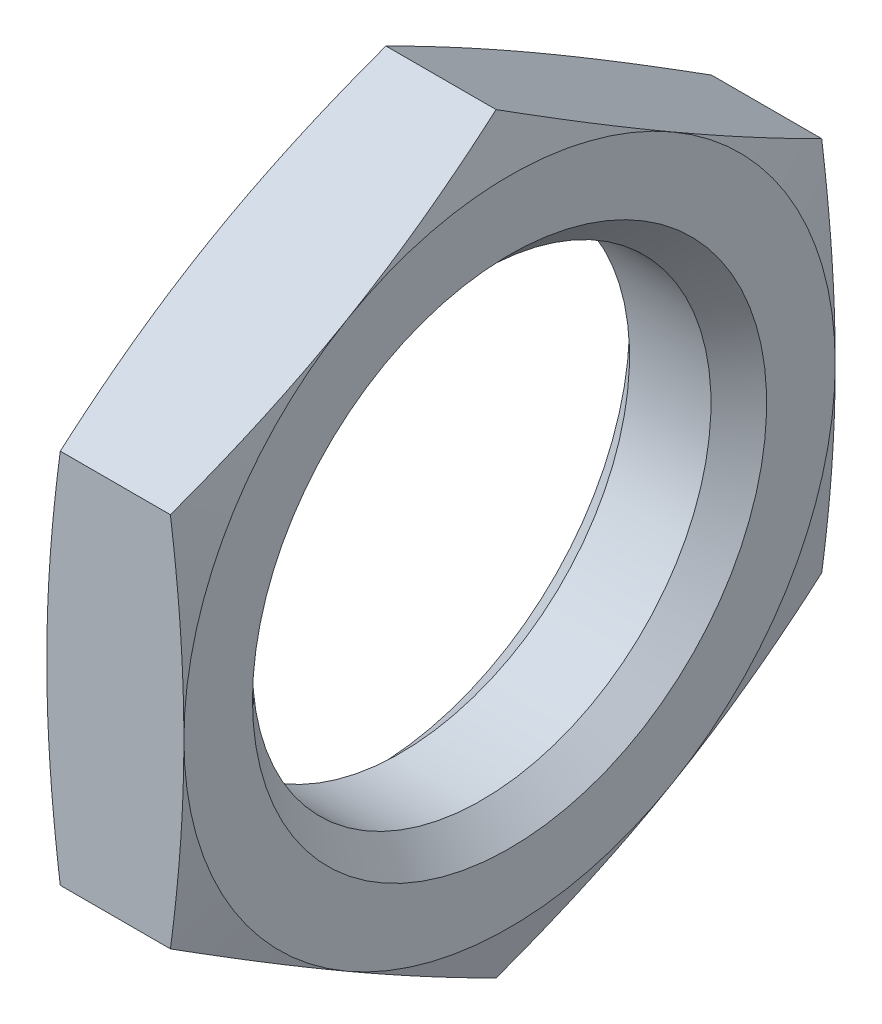
ISO-10303-21;
HEADER;
FILE_DESCRIPTION(('STEP AP214'),'2;1');
FILE_NAME('part.step','',(''),(''),'','','');
FILE_SCHEMA(('AUTOMOTIVE_DESIGN { 1 0 10303 214 1 1 1 1 }'));
ENDSEC;
DATA;
#1=APPLICATION_CONTEXT('core data for automotive mechanical design processes');
#2=APPLICATION_PROTOCOL_DEFINITION('international standard','automotive_design',2000,#1);
#3=PRODUCT_CONTEXT('',#1,'mechanical');
#4=PRODUCT('Part','Part','',(#3));
#5=PRODUCT_RELATED_PRODUCT_CATEGORY('part','',(#4));
#6=PRODUCT_DEFINITION_FORMATION('','',#4);
#7=PRODUCT_DEFINITION_CONTEXT('part definition',#1,'design');
#8=PRODUCT_DEFINITION('design','',#6,#7);
#9=PRODUCT_DEFINITION_SHAPE('','',#8);
#10=(LENGTH_UNIT() NAMED_UNIT(*) SI_UNIT(.MILLI.,.METRE.));
#11=(NAMED_UNIT(*) PLANE_ANGLE_UNIT() SI_UNIT($,.RADIAN.));
#12=(NAMED_UNIT(*) SI_UNIT($,.STERADIAN.) SOLID_ANGLE_UNIT());
#13=UNCERTAINTY_MEASURE_WITH_UNIT(LENGTH_MEASURE(1.E-05),#10,'distance_accuracy_value','');
#14=(GEOMETRIC_REPRESENTATION_CONTEXT(3) GLOBAL_UNCERTAINTY_ASSIGNED_CONTEXT((#13)) GLOBAL_UNIT_ASSIGNED_CONTEXT((#10,
#11,#12)) REPRESENTATION_CONTEXT('',''));
#15=CARTESIAN_POINT('',(0.,0.,0.));
#16=DIRECTION('',(0.,0.,1.));
#17=DIRECTION('',(1.,0.,0.));
#18=AXIS2_PLACEMENT_3D('',#15,#16,#17);
#19=CARTESIAN_POINT('',(1.5273103968574,0.,0.));
#20=DIRECTION('',(1.,0.,0.));
#21=DIRECTION('',(0.,0.,-1.));
#22=AXIS2_PLACEMENT_3D('',#19,#20,#21);
#23=CONICAL_SURFACE('',#22,15.2,1.30899693899575);
#24=CARTESIAN_POINT('',(2.11795617576749,-14.5828788864734,-9.5));
#25=CARTESIAN_POINT('',(2.02102911970548,-14.1510396786017,-9.5));
#26=CARTESIAN_POINT('',(1.92527526586822,-13.718932390817,-9.5));
#27=CARTESIAN_POINT('',(1.73674736557421,-12.8540498325514,-9.5));
#28=CARTESIAN_POINT('',(1.64397344561056,-12.4212745345298,-9.5));
#29=CARTESIAN_POINT('',(1.46196028680276,-11.5545471316866,-9.5));
#30=CARTESIAN_POINT('',(1.37272450759564,-11.1205942977726,-9.5));
#31=CARTESIAN_POINT('',(1.19873906663887,-10.2517907113353,-9.5));
#32=CARTESIAN_POINT('',(1.11398936777066,-9.8169399662724,-9.5));
#33=CARTESIAN_POINT('',(0.95070120228172,-8.9496618701595,-9.5));
#34=CARTESIAN_POINT('',(0.872118561768801,-8.51724287668628,-9.5));
#35=CARTESIAN_POINT('',(0.721731520401339,-7.65121852684343,-9.5));
#36=CARTESIAN_POINT('',(0.649927144419818,-7.21761316612639,-9.5));
#37=CARTESIAN_POINT('',(0.514700877279495,-6.34913927939215,-9.5));
#38=CARTESIAN_POINT('',(0.451277981734393,-5.91427091112059,-9.5));
#39=CARTESIAN_POINT('',(0.334669170998894,-5.04314803743013,-9.5));
#40=CARTESIAN_POINT('',(0.281483268537182,-4.6068935302884,-9.5));
#41=CARTESIAN_POINT('',(0.18683807676875,-3.72804397975255,-9.5));
#42=CARTESIAN_POINT('',(0.145519944028974,-3.28543350705766,-9.5));
#43=CARTESIAN_POINT('',(0.0774510467649186,-2.39908405840373,-9.5));
#44=CARTESIAN_POINT('',(0.0506999479860786,-1.95534510857344,-9.5));
#45=CARTESIAN_POINT('',(0.0133244257647249,-1.06738508999545,-9.5));
#46=CARTESIAN_POINT('',(0.00269237295629692,-0.623164348983744,-9.5));
#47=CARTESIAN_POINT('',(-0.00178973272518255,0.265362842653987,-9.5));
#48=CARTESIAN_POINT('',(0.00436018726561291,0.709669293140261,-9.5));
#49=CARTESIAN_POINT('',(0.0330974102182162,1.59937914975071,-9.5));
#50=CARTESIAN_POINT('',(0.0557452296848477,2.04478056106371,-9.5));
#51=CARTESIAN_POINT('',(0.11617942696362,2.93454570856774,-9.5));
#52=CARTESIAN_POINT('',(0.153966145063784,3.37890942120782,-9.5));
#53=CARTESIAN_POINT('',(0.242751267709381,4.26659442913664,-9.5));
#54=CARTESIAN_POINT('',(0.29375849072049,4.70991482857134,-9.5));
#55=CARTESIAN_POINT('',(0.406839634371267,5.59512588176262,-9.5));
#56=CARTESIAN_POINT('',(0.468913587389593,6.03701653133224,-9.5));
#57=CARTESIAN_POINT('',(0.599048118864374,6.89906110211217,-9.5));
#58=CARTESIAN_POINT('',(0.666700367957521,7.31927728461905,-9.5));
#59=CARTESIAN_POINT('',(0.808736736916568,8.15857614341937,-9.5));
#60=CARTESIAN_POINT('',(0.883121056022278,8.5776587857867,-9.5));
#61=CARTESIAN_POINT('',(1.03736673912841,9.41485705112565,-9.5));
#62=CARTESIAN_POINT('',(1.11722870010277,9.8329725635464,-9.5));
#63=CARTESIAN_POINT('',(1.28139870982473,10.6683222148234,-9.5));
#64=CARTESIAN_POINT('',(1.36570671471879,11.0855563623307,-9.5));
#65=CARTESIAN_POINT('',(1.53797219085445,11.9193845551216,-9.5));
#66=CARTESIAN_POINT('',(1.62593062993512,12.3359783998873,-9.5));
#67=CARTESIAN_POINT('',(1.80482910383503,13.1685263589533,-9.5));
#68=CARTESIAN_POINT('',(1.89576915643975,13.5844804694222,-9.5));
#69=CARTESIAN_POINT('',(2.17224142648337,14.8314693365754,-9.5));
#70=CARTESIAN_POINT('',(2.36143843850156,15.6616911916322,-9.5));
#71=CARTESIAN_POINT('',(2.74466804030623,17.3122092321721,-9.5));
#72=CARTESIAN_POINT('',(2.93863285102971,18.1325212596396,-9.5));
#73=CARTESIAN_POINT('',(3.33135805112304,19.7720115420896,-9.5));
#74=CARTESIAN_POINT('',(3.53011853441663,20.5911897745339,-9.5));
#75=CARTESIAN_POINT('',(3.93091497469927,22.2276135219527,-9.5));
#76=CARTESIAN_POINT('',(4.13294633523018,23.0448601649217,-9.5));
#77=CARTESIAN_POINT('',(4.4379949347591,24.2702164210139,-9.5));
#78=CARTESIAN_POINT('',(4.54000967178867,24.6785760641106,-9.5));
#79=CARTESIAN_POINT('',(4.7446295755562,25.495146959871,-9.5));
#80=CARTESIAN_POINT('',(4.84723474167105,25.9033582126909,-9.5));
#81=CARTESIAN_POINT('',(4.95009630742133,26.3115048418919,-9.5));
#82=B_SPLINE_CURVE_WITH_KNOTS('',3,(#24,#25,#26,#27,#28,#29,#30,#31,#32,#33,#34,#35,#36,#37,#38,
#39,#40,#41,#42,#43,#44,#45,#46,#47,#48,#49,#50,#51,#52,#53,#54,#55,#56,#57,#58,#59,#60,#61,#62,
#63,#64,#65,#66,#67,#68,#69,#70,#71,#72,#73,#74,#75,#76,#77,#78,#79,#80,#81),.UNSPECIFIED.,.F.,
.F.,(4,2,2,2,2,2,2,2,2,2,2,2,2,2,2,2,2,2,2,2,2,2,2,2,2,2,2,2,4),(0.,1.32775513693369,
2.65556656052248,3.98464583097028,5.31371410267775,6.63217499979828,7.95064073485839,
9.26894832935247,10.5872575630205,11.9206526829388,13.2540172055381,14.5867504311469,
15.919481501751,17.257125983965,18.5948005350728,19.9333696610769,21.2719427034849,
22.548758870357,23.8256128377643,25.102606183293,26.3795869355534,27.6569084439086,
28.9342375729365,31.4887102155715,34.0174890809351,36.5463175129496,39.0718568428768,
40.3345842784341,41.597310381647),.UNSPECIFIED.);
#83=CARTESIAN_POINT('',(0.,0.,-9.5));
#84=VERTEX_POINT('',#83);
#85=CARTESIAN_POINT('',(0.393792901110108,-5.4848275573014,-9.5));
#86=VERTEX_POINT('',#85);
#87=EDGE_CURVE('E317',#84,#86,#82,.F.);
#88=ORIENTED_EDGE('',*,*,#87,.T.);
#89=CARTESIAN_POINT('',(0.393823841706307,-5.48471208724756,-9.5002));
#90=CARTESIAN_POINT('',(0.332765168501586,-5.71249277379558,-9.10567227791593));
#91=CARTESIAN_POINT('',(0.277334017198159,-5.94068644620377,-8.71042924333922));
#92=CARTESIAN_POINT('',(0.179946740310484,-6.39787965544267,-7.918547376062));
#93=CARTESIAN_POINT('',(0.137996087733635,-6.62687948151889,-7.52190804237355));
#94=CARTESIAN_POINT('',(0.0700188061817635,-7.084296605516,-6.72963834335856));
#95=CARTESIAN_POINT('',(0.0439111133205847,-7.31271081054298,-6.33401333508139));
#96=CARTESIAN_POINT('',(0.00890337477945512,-7.76983049897969,-5.54225880956897));
#97=CARTESIAN_POINT('',(0.,-7.99853591746595,-5.14612940478448));
#98=CARTESIAN_POINT('',(0.,-8.45594675443846,-4.35387059521551));
#99=CARTESIAN_POINT('',(0.00890337477946237,-8.68465217292471,-3.95774119043103));
#100=CARTESIAN_POINT('',(0.0439111133205986,-9.14177186136143,-3.16598666491861));
#101=CARTESIAN_POINT('',(0.0700188061817803,-9.37018606638841,-2.77036165664143));
#102=CARTESIAN_POINT('',(0.137996087733658,-9.82760319038551,-1.97809195762644));
#103=CARTESIAN_POINT('',(0.17994674031051,-10.0566030164617,-1.581452623938));
#104=CARTESIAN_POINT('',(0.277334017198191,-10.5137962257006,-0.789570756660775));
#105=CARTESIAN_POINT('',(0.33276516850162,-10.7419898981088,-0.394327722084066));
#106=CARTESIAN_POINT('',(0.393823841706343,-10.9697705846568,0.000200000000002014));
#107=B_SPLINE_CURVE_WITH_KNOTS('',3,(#89,#90,#91,#92,#93,#94,#95,#96,#97,#98,#99,#100,#101,#102,
#103,#104,#105,#106),.UNSPECIFIED.,.F.,.F.,(4,2,2,2,2,2,2,2,4),(0.,1.3789772207545,
2.75851359330416,4.13093041065499,5.50308163364598,6.87523285663696,8.24764967398779,
9.62718604653745,11.006163267292),.UNSPECIFIED.);
#108=CARTESIAN_POINT('',(0.,-8.22724133595213,-4.75000000000012));
#109=VERTEX_POINT('',#108);
#110=EDGE_CURVE('E328',#86,#109,#107,.T.);
#111=ORIENTED_EDGE('',*,*,#110,.T.);
#112=CARTESIAN_POINT('',(0.,0.,0.));
#113=DIRECTION('',(-1.,0.,0.));
#114=DIRECTION('',(0.,0.,1.));
#115=AXIS2_PLACEMENT_3D('',#112,#113,#114);
#116=CIRCLE('',#115,9.5);
#117=EDGE_CURVE('E165',#84,#109,#116,.T.);
#118=ORIENTED_EDGE('',*,*,#117,.F.);
#119=EDGE_LOOP('',(#88,#111,#118));
#120=FACE_BOUND('',#119,.T.);
#121=ADVANCED_FACE('F36',(#120),#23,.T.);
#122=CARTESIAN_POINT('',(0.,-8.22724133595213,4.75000000000012));
#123=VERTEX_POINT('',#122);
#124=EDGE_CURVE('E163',#109,#123,#116,.T.);
#125=ORIENTED_EDGE('',*,*,#124,.F.);
#126=CARTESIAN_POINT('',(0.393792901110144,-10.969655114603,0.));
#127=VERTEX_POINT('',#126);
#128=EDGE_CURVE('E323',#109,#127,#107,.T.);
#129=ORIENTED_EDGE('',*,*,#128,.T.);
#130=CARTESIAN_POINT('',(0.393823841706342,-10.9697705846568,-0.0002));
#131=CARTESIAN_POINT('',(0.33276516850162,-10.7419898981088,0.394327722084067));
#132=CARTESIAN_POINT('',(0.277334017198191,-10.5137962257006,0.789570756660776));
#133=CARTESIAN_POINT('',(0.17994674031051,-10.0566030164617,1.581452623938));
#134=CARTESIAN_POINT('',(0.137996087733658,-9.82760319038551,1.97809195762644));
#135=CARTESIAN_POINT('',(0.0700188061817805,-9.37018606638841,2.77036165664143));
#136=CARTESIAN_POINT('',(0.0439111133205988,-9.14177186136143,3.16598666491861));
#137=CARTESIAN_POINT('',(0.00890337477946252,-8.68465217292471,3.95774119043103));
#138=CARTESIAN_POINT('',(0.,-8.45594675443846,4.35387059521551));
#139=CARTESIAN_POINT('',(0.,-7.99853591746595,5.14612940478448));
#140=CARTESIAN_POINT('',(0.00890337477945491,-7.76983049897969,5.54225880956897));
#141=CARTESIAN_POINT('',(0.0439111133205846,-7.31271081054298,6.33401333508139));
#142=CARTESIAN_POINT('',(0.0700188061817635,-7.084296605516,6.72963834335856));
#143=CARTESIAN_POINT('',(0.137996087733635,-6.62687948151889,7.52190804237355));
#144=CARTESIAN_POINT('',(0.179946740310484,-6.39787965544267,7.918547376062));
#145=CARTESIAN_POINT('',(0.277334017198159,-5.94068644620377,8.71042924333922));
#146=CARTESIAN_POINT('',(0.332765168501585,-5.71249277379558,9.10567227791593));
#147=CARTESIAN_POINT('',(0.393823841706306,-5.48471208724756,9.5002));
#148=B_SPLINE_CURVE_WITH_KNOTS('',3,(#130,#131,#132,#133,#134,#135,#136,#137,#138,#139,#140,
#141,#142,#143,#144,#145,#146,#147),.UNSPECIFIED.,.F.,.F.,(4,2,2,2,2,2,2,2,4),(0.,
1.3789772207545,2.75851359330416,4.13093041065499,5.50308163364597,6.87523285663696,
8.24764967398779,9.62718604653745,11.0061632672919),.UNSPECIFIED.);
#149=EDGE_CURVE('E189',#127,#123,#148,.T.);
#150=ORIENTED_EDGE('',*,*,#149,.T.);
#151=EDGE_LOOP('',(#125,#129,#150));
#152=FACE_BOUND('',#151,.T.);
#153=ADVANCED_FACE('F341',(#152),#23,.T.);
#154=CARTESIAN_POINT('',(0.,0.,9.5));
#155=VERTEX_POINT('',#154);
#156=EDGE_CURVE('E157',#123,#155,#116,.T.);
#157=ORIENTED_EDGE('',*,*,#156,.F.);
#158=CARTESIAN_POINT('',(0.393792901110108,-5.4848275573014,9.5));
#159=VERTEX_POINT('',#158);
#160=EDGE_CURVE('E190',#123,#159,#148,.T.);
#161=ORIENTED_EDGE('',*,*,#160,.T.);
#162=CARTESIAN_POINT('',(2.11795617576749,-14.5828788864734,9.5));
#163=CARTESIAN_POINT('',(2.02102911970548,-14.1510396786017,9.5));
#164=CARTESIAN_POINT('',(1.92527526586822,-13.718932390817,9.5));
#165=CARTESIAN_POINT('',(1.73674736557421,-12.8540498325514,9.5));
#166=CARTESIAN_POINT('',(1.64397344561056,-12.4212745345298,9.5));
#167=CARTESIAN_POINT('',(1.46196028680276,-11.5545471316866,9.5));
#168=CARTESIAN_POINT('',(1.37272450759564,-11.1205942977726,9.5));
#169=CARTESIAN_POINT('',(1.19873906663887,-10.2517907113353,9.5));
#170=CARTESIAN_POINT('',(1.11398936777066,-9.8169399662724,9.5));
#171=CARTESIAN_POINT('',(0.95070120228172,-8.9496618701595,9.5));
#172=CARTESIAN_POINT('',(0.872118561768801,-8.51724287668628,9.5));
#173=CARTESIAN_POINT('',(0.721731520401339,-7.65121852684343,9.5));
#174=CARTESIAN_POINT('',(0.649927144419818,-7.21761316612639,9.5));
#175=CARTESIAN_POINT('',(0.514700877279495,-6.34913927939215,9.5));
#176=CARTESIAN_POINT('',(0.451277981734393,-5.91427091112059,9.5));
#177=CARTESIAN_POINT('',(0.334669170998894,-5.04314803743013,9.5));
#178=CARTESIAN_POINT('',(0.281483268537182,-4.6068935302884,9.5));
#179=CARTESIAN_POINT('',(0.18683807676875,-3.72804397975255,9.5));
#180=CARTESIAN_POINT('',(0.145519944028974,-3.28543350705766,9.5));
#181=CARTESIAN_POINT('',(0.0774510467649186,-2.39908405840373,9.5));
#182=CARTESIAN_POINT('',(0.0506999479860786,-1.95534510857344,9.5));
#183=CARTESIAN_POINT('',(0.0133244257647249,-1.06738508999545,9.5));
#184=CARTESIAN_POINT('',(0.00269237295629692,-0.623164348983744,9.5));
#185=CARTESIAN_POINT('',(-0.00178973272518255,0.265362842653987,9.5));
#186=CARTESIAN_POINT('',(0.00436018726561291,0.709669293140261,9.5));
#187=CARTESIAN_POINT('',(0.0330974102182162,1.59937914975071,9.5));
#188=CARTESIAN_POINT('',(0.0557452296848477,2.04478056106371,9.5));
#189=CARTESIAN_POINT('',(0.11617942696362,2.93454570856774,9.5));
#190=CARTESIAN_POINT('',(0.153966145063784,3.37890942120782,9.5));
#191=CARTESIAN_POINT('',(0.242751267709381,4.26659442913664,9.5));
#192=CARTESIAN_POINT('',(0.29375849072049,4.70991482857134,9.5));
#193=CARTESIAN_POINT('',(0.406839634371267,5.59512588176262,9.5));
#194=CARTESIAN_POINT('',(0.468913587389593,6.03701653133224,9.5));
#195=CARTESIAN_POINT('',(0.599048118864374,6.89906110211217,9.5));
#196=CARTESIAN_POINT('',(0.666700367957521,7.31927728461905,9.5));
#197=CARTESIAN_POINT('',(0.808736736916568,8.15857614341937,9.5));
#198=CARTESIAN_POINT('',(0.883121056022278,8.5776587857867,9.5));
#199=CARTESIAN_POINT('',(1.03736673912841,9.41485705112565,9.5));
#200=CARTESIAN_POINT('',(1.11722870010277,9.8329725635464,9.5));
#201=CARTESIAN_POINT('',(1.28139870982473,10.6683222148234,9.5));
#202=CARTESIAN_POINT('',(1.36570671471879,11.0855563623307,9.5));
#203=CARTESIAN_POINT('',(1.53797219085445,11.9193845551216,9.5));
#204=CARTESIAN_POINT('',(1.62593062993512,12.3359783998873,9.5));
#205=CARTESIAN_POINT('',(1.80482910383503,13.1685263589533,9.5));
#206=CARTESIAN_POINT('',(1.89576915643975,13.5844804694222,9.5));
#207=CARTESIAN_POINT('',(2.17224142648337,14.8314693365754,9.5));
#208=CARTESIAN_POINT('',(2.36143843850156,15.6616911916322,9.5));
#209=CARTESIAN_POINT('',(2.74466804030623,17.3122092321721,9.5));
#210=CARTESIAN_POINT('',(2.93863285102971,18.1325212596396,9.5));
#211=CARTESIAN_POINT('',(3.33135805112304,19.7720115420896,9.5));
#212=CARTESIAN_POINT('',(3.53011853441663,20.5911897745339,9.5));
#213=CARTESIAN_POINT('',(3.93091497469927,22.2276135219527,9.5));
#214=CARTESIAN_POINT('',(4.13294633523018,23.0448601649217,9.5));
#215=CARTESIAN_POINT('',(4.4379949347591,24.2702164210139,9.5));
#216=CARTESIAN_POINT('',(4.54000967178867,24.6785760641106,9.5));
#217=CARTESIAN_POINT('',(4.7446295755562,25.495146959871,9.5));
#218=CARTESIAN_POINT('',(4.84723474167105,25.9033582126909,9.5));
#219=CARTESIAN_POINT('',(4.95009630742133,26.3115048418919,9.5));
#220=B_SPLINE_CURVE_WITH_KNOTS('',3,(#162,#163,#164,#165,#166,#167,#168,#169,#170,#171,#172,
#173,#174,#175,#176,#177,#178,#179,#180,#181,#182,#183,#184,#185,#186,#187,#188,#189,#190,#191,
#192,#193,#194,#195,#196,#197,#198,#199,#200,#201,#202,#203,#204,#205,#206,#207,#208,#209,#210,
#211,#212,#213,#214,#215,#216,#217,#218,#219),.UNSPECIFIED.,.F.,.F.,(4,2,2,2,2,2,2,2,2,2,2,2,2,
2,2,2,2,2,2,2,2,2,2,2,2,2,2,2,4),(0.,1.32775513693369,2.65556656052248,3.98464583097028,
5.31371410267775,6.63217499979828,7.95064073485839,9.26894832935247,10.5872575630205,
11.9206526829388,13.2540172055381,14.5867504311469,15.919481501751,17.257125983965,
18.5948005350728,19.9333696610769,21.2719427034849,22.548758870357,23.8256128377643,
25.102606183293,26.3795869355534,27.6569084439086,28.9342375729365,31.4887102155715,
34.0174890809351,36.5463175129496,39.0718568428768,40.3345842784341,41.597310381647),.UNSPECIFIED.);
#221=EDGE_CURVE('E188',#159,#155,#220,.T.);
#222=ORIENTED_EDGE('',*,*,#221,.T.);
#223=EDGE_LOOP('',(#157,#161,#222));
#224=FACE_BOUND('',#223,.T.);
#225=ADVANCED_FACE('F282',(#224),#23,.T.);
#226=CARTESIAN_POINT('',(0.393823841706342,10.9697705846568,0.0002));
#227=CARTESIAN_POINT('',(0.33276516850162,10.7419898981088,-0.394327722084067));
#228=CARTESIAN_POINT('',(0.277334017198191,10.5137962257006,-0.789570756660776));
#229=CARTESIAN_POINT('',(0.17994674031051,10.0566030164617,-1.581452623938));
#230=CARTESIAN_POINT('',(0.137996087733658,9.82760319038551,-1.97809195762644));
#231=CARTESIAN_POINT('',(0.0700188061817805,9.37018606638841,-2.77036165664143));
#232=CARTESIAN_POINT('',(0.0439111133205988,9.14177186136143,-3.16598666491861));
#233=CARTESIAN_POINT('',(0.00890337477946252,8.68465217292471,-3.95774119043103));
#234=CARTESIAN_POINT('',(0.,8.45594675443846,-4.35387059521551));
#235=CARTESIAN_POINT('',(0.,7.99853591746595,-5.14612940478448));
#236=CARTESIAN_POINT('',(0.00890337477945491,7.76983049897969,-5.54225880956897));
#237=CARTESIAN_POINT('',(0.0439111133205846,7.31271081054298,-6.33401333508139));
#238=CARTESIAN_POINT('',(0.0700188061817635,7.084296605516,-6.72963834335856));
#239=CARTESIAN_POINT('',(0.137996087733635,6.62687948151889,-7.52190804237355));
#240=CARTESIAN_POINT('',(0.179946740310484,6.39787965544267,-7.918547376062));
#241=CARTESIAN_POINT('',(0.277334017198159,5.94068644620377,-8.71042924333922));
#242=CARTESIAN_POINT('',(0.332765168501585,5.71249277379558,-9.10567227791593));
#243=CARTESIAN_POINT('',(0.393823841706306,5.48471208724756,-9.5002));
#244=B_SPLINE_CURVE_WITH_KNOTS('',3,(#226,#227,#228,#229,#230,#231,#232,#233,#234,#235,#236,
#237,#238,#239,#240,#241,#242,#243),.UNSPECIFIED.,.F.,.F.,(4,2,2,2,2,2,2,2,4),(0.,
1.3789772207545,2.75851359330416,4.13093041065499,5.50308163364597,6.87523285663696,
8.24764967398779,9.62718604653745,11.0061632672919),.UNSPECIFIED.);
#245=CARTESIAN_POINT('',(0.,8.22724133595213,-4.75000000000012));
#246=VERTEX_POINT('',#245);
#247=CARTESIAN_POINT('',(0.393792901110108,5.4848275573014,-9.5));
#248=VERTEX_POINT('',#247);
#249=EDGE_CURVE('E144',#246,#248,#244,.T.);
#250=ORIENTED_EDGE('',*,*,#249,.T.);
#251=EDGE_CURVE('E322',#248,#84,#82,.F.);
#252=ORIENTED_EDGE('',*,*,#251,.T.);
#253=EDGE_CURVE('E151',#246,#84,#116,.T.);
#254=ORIENTED_EDGE('',*,*,#253,.F.);
#255=EDGE_LOOP('',(#250,#252,#254));
#256=FACE_BOUND('',#255,.T.);
#257=ADVANCED_FACE('F336',(#256),#23,.T.);
#258=CARTESIAN_POINT('',(0.,8.22724133595213,4.75000000000011));
#259=VERTEX_POINT('',#258);
#260=EDGE_CURVE('E142',#155,#259,#116,.T.);
#261=ORIENTED_EDGE('',*,*,#260,.F.);
#262=CARTESIAN_POINT('',(0.393792901110108,5.4848275573014,9.5));
#263=VERTEX_POINT('',#262);
#264=EDGE_CURVE('E143',#155,#263,#220,.T.);
#265=ORIENTED_EDGE('',*,*,#264,.T.);
#266=CARTESIAN_POINT('',(0.393823841706307,5.48471208724756,9.5002));
#267=CARTESIAN_POINT('',(0.332765168501586,5.71249277379558,9.10567227791593));
#268=CARTESIAN_POINT('',(0.277334017198159,5.94068644620377,8.71042924333922));
#269=CARTESIAN_POINT('',(0.179946740310484,6.39787965544267,7.918547376062));
#270=CARTESIAN_POINT('',(0.137996087733635,6.62687948151889,7.52190804237355));
#271=CARTESIAN_POINT('',(0.0700188061817635,7.084296605516,6.72963834335856));
#272=CARTESIAN_POINT('',(0.0439111133205847,7.31271081054298,6.33401333508139));
#273=CARTESIAN_POINT('',(0.00890337477945512,7.76983049897969,5.54225880956897));
#274=CARTESIAN_POINT('',(0.,7.99853591746595,5.14612940478448));
#275=CARTESIAN_POINT('',(0.,8.45594675443846,4.35387059521551));
#276=CARTESIAN_POINT('',(0.00890337477946237,8.68465217292471,3.95774119043103));
#277=CARTESIAN_POINT('',(0.0439111133205986,9.14177186136143,3.16598666491861));
#278=CARTESIAN_POINT('',(0.0700188061817803,9.37018606638841,2.77036165664143));
#279=CARTESIAN_POINT('',(0.137996087733658,9.82760319038551,1.97809195762644));
#280=CARTESIAN_POINT('',(0.17994674031051,10.0566030164617,1.581452623938));
#281=CARTESIAN_POINT('',(0.277334017198191,10.5137962257006,0.789570756660775));
#282=CARTESIAN_POINT('',(0.33276516850162,10.7419898981088,0.394327722084066));
#283=CARTESIAN_POINT('',(0.393823841706343,10.9697705846568,-0.000200000000002014));
#284=B_SPLINE_CURVE_WITH_KNOTS('',3,(#266,#267,#268,#269,#270,#271,#272,#273,#274,#275,#276,
#277,#278,#279,#280,#281,#282,#283),.UNSPECIFIED.,.F.,.F.,(4,2,2,2,2,2,2,2,4),(0.,
1.3789772207545,2.75851359330416,4.13093041065499,5.50308163364598,6.87523285663696,
8.24764967398779,9.62718604653745,11.006163267292),.UNSPECIFIED.);
#285=EDGE_CURVE('E131',#263,#259,#284,.T.);
#286=ORIENTED_EDGE('',*,*,#285,.T.);
#287=EDGE_LOOP('',(#261,#265,#286));
#288=FACE_BOUND('',#287,.T.);
#289=ADVANCED_FACE('F140',(#288),#23,.T.);
#290=CARTESIAN_POINT('',(4.,0.,0.));
#291=DIRECTION('',(-1.,0.,0.));
#292=DIRECTION('',(0.,0.,1.));
#293=AXIS2_PLACEMENT_3D('',#290,#291,#292);
#294=CONICAL_SURFACE('',#293,9.5,1.30899693899575);
#295=CARTESIAN_POINT('',(3.60617615829366,10.9697705846568,-0.000200000000000056));
#296=CARTESIAN_POINT('',(3.66723483149838,10.7419898981088,0.394327722084067));
#297=CARTESIAN_POINT('',(3.72266598280181,10.5137962257006,0.789570756660776));
#298=CARTESIAN_POINT('',(3.82005325968949,10.0566030164617,1.581452623938));
#299=CARTESIAN_POINT('',(3.86200391226634,9.82760319038551,1.97809195762644));
#300=CARTESIAN_POINT('',(3.92998119381822,9.37018606638841,2.77036165664143));
#301=CARTESIAN_POINT('',(3.9560888866794,9.14177186136143,3.16598666491861));
#302=CARTESIAN_POINT('',(3.99109662522054,8.68465217292471,3.95774119043103));
#303=CARTESIAN_POINT('',(3.99999999999999,8.45594675443846,4.35387059521551));
#304=CARTESIAN_POINT('',(3.99999999999999,7.99853591746595,5.14612940478448));
#305=CARTESIAN_POINT('',(3.99109662522054,7.76983049897969,5.54225880956897));
#306=CARTESIAN_POINT('',(3.95608888667942,7.31271081054298,6.33401333508139));
#307=CARTESIAN_POINT('',(3.92998119381824,7.084296605516,6.72963834335856));
#308=CARTESIAN_POINT('',(3.86200391226637,6.6268794815189,7.52190804237355));
#309=CARTESIAN_POINT('',(3.82005325968952,6.39787965544267,7.918547376062));
#310=CARTESIAN_POINT('',(3.72266598280184,5.94068644620377,8.71042924333922));
#311=CARTESIAN_POINT('',(3.66723483149842,5.71249277379558,9.10567227791593));
#312=CARTESIAN_POINT('',(3.60617615829369,5.48471208724756,9.5002));
#313=B_SPLINE_CURVE_WITH_KNOTS('',3,(#295,#296,#297,#298,#299,#300,#301,#302,#303,#304,#305,
#306,#307,#308,#309,#310,#311,#312),.UNSPECIFIED.,.F.,.F.,(4,2,2,2,2,2,2,2,4),(0.,
1.3789772207545,2.75851359330416,4.13093041065499,5.50308163364597,6.87523285663696,
8.24764967398779,9.62718604653745,11.0061632672919),.UNSPECIFIED.);
#314=CARTESIAN_POINT('',(4.,8.22724133595213,4.75000000000012));
#315=VERTEX_POINT('',#314);
#316=CARTESIAN_POINT('',(3.60620709888989,5.4848275573014,9.5));
#317=VERTEX_POINT('',#316);
#318=EDGE_CURVE('E158',#315,#317,#313,.T.);
#319=ORIENTED_EDGE('',*,*,#318,.T.);
#320=CARTESIAN_POINT('',(1.88204382423251,-14.5828788864734,9.5));
#321=CARTESIAN_POINT('',(1.97897088029452,-14.1510396786017,9.5));
#322=CARTESIAN_POINT('',(2.07472473413178,-13.718932390817,9.5));
#323=CARTESIAN_POINT('',(2.26325263442579,-12.8540498325514,9.5));
#324=CARTESIAN_POINT('',(2.35602655438944,-12.4212745345298,9.5));
#325=CARTESIAN_POINT('',(2.53803971319724,-11.5545471316866,9.5));
#326=CARTESIAN_POINT('',(2.62727549240436,-11.1205942977726,9.5));
#327=CARTESIAN_POINT('',(2.80126093336113,-10.2517907113353,9.5));
#328=CARTESIAN_POINT('',(2.88601063222934,-9.8169399662724,9.5));
#329=CARTESIAN_POINT('',(3.04929879771828,-8.9496618701595,9.5));
#330=CARTESIAN_POINT('',(3.1278814382312,-8.51724287668628,9.5));
#331=CARTESIAN_POINT('',(3.27826847959866,-7.65121852684343,9.5));
#332=CARTESIAN_POINT('',(3.35007285558018,-7.21761316612639,9.5));
#333=CARTESIAN_POINT('',(3.4852991227205,-6.34913927939215,9.5));
#334=CARTESIAN_POINT('',(3.54872201826561,-5.91427091112059,9.5));
#335=CARTESIAN_POINT('',(3.66533082900111,-5.04314803743013,9.5));
#336=CARTESIAN_POINT('',(3.71851673146282,-4.6068935302884,9.5));
#337=CARTESIAN_POINT('',(3.81316192323125,-3.72804397975255,9.5));
#338=CARTESIAN_POINT('',(3.85448005597103,-3.28543350705766,9.5));
#339=CARTESIAN_POINT('',(3.92254895323508,-2.39908405840373,9.5));
#340=CARTESIAN_POINT('',(3.94930005201392,-1.95534510857344,9.5));
#341=CARTESIAN_POINT('',(3.98667557423528,-1.06738508999545,9.5));
#342=CARTESIAN_POINT('',(3.9973076270437,-0.623164348983747,9.5));
#343=CARTESIAN_POINT('',(4.00178973272518,0.265362842653984,9.5));
#344=CARTESIAN_POINT('',(3.99563981273439,0.709669293140258,9.5));
#345=CARTESIAN_POINT('',(3.96690258978178,1.59937914975071,9.5));
#346=CARTESIAN_POINT('',(3.94425477031515,2.0447805610637,9.5));
#347=CARTESIAN_POINT('',(3.88382057303638,2.93454570856773,9.5));
#348=CARTESIAN_POINT('',(3.84603385493622,3.37890942120782,9.5));
#349=CARTESIAN_POINT('',(3.75724873229062,4.26659442913664,9.5));
#350=CARTESIAN_POINT('',(3.70624150927951,4.70991482857134,9.5));
#351=CARTESIAN_POINT('',(3.59316036562873,5.59512588176263,9.5));
#352=CARTESIAN_POINT('',(3.53108641261041,6.03701653133224,9.5));
#353=CARTESIAN_POINT('',(3.40095188113563,6.89906110211217,9.5));
#354=CARTESIAN_POINT('',(3.33329963204248,7.31927728461905,9.5));
#355=CARTESIAN_POINT('',(3.19126326308343,8.15857614341937,9.5));
#356=CARTESIAN_POINT('',(3.11687894397772,8.5776587857867,9.5));
#357=CARTESIAN_POINT('',(2.96263326087159,9.41485705112566,9.5));
#358=CARTESIAN_POINT('',(2.88277129989723,9.8329725635464,9.5));
#359=CARTESIAN_POINT('',(2.71860129017527,10.6683222148234,9.5));
#360=CARTESIAN_POINT('',(2.63429328528121,11.0855563623307,9.5));
#361=CARTESIAN_POINT('',(2.46202780914555,11.9193845551216,9.5));
#362=CARTESIAN_POINT('',(2.37406937006488,12.3359783998873,9.5));
#363=CARTESIAN_POINT('',(2.19517089616496,13.1685263589534,9.5));
#364=CARTESIAN_POINT('',(2.10423084356024,13.5844804694222,9.5));
#365=CARTESIAN_POINT('',(1.82775857351663,14.8314693365754,9.5));
#366=CARTESIAN_POINT('',(1.63856156149844,15.6616911916322,9.5));
#367=CARTESIAN_POINT('',(1.25533195969376,17.3122092321721,9.5));
#368=CARTESIAN_POINT('',(1.06136714897029,18.1325212596396,9.5));
#369=CARTESIAN_POINT('',(0.668641948876954,19.7720115420897,9.5));
#370=CARTESIAN_POINT('',(0.469881465583368,20.5911897745339,9.5));
#371=CARTESIAN_POINT('',(0.0690850253007227,22.2276135219527,9.5));
#372=CARTESIAN_POINT('',(-0.132946335230183,23.0448601649217,9.5));
#373=CARTESIAN_POINT('',(-0.437994934759101,24.2702164210139,9.5));
#374=CARTESIAN_POINT('',(-0.540009671788675,24.6785760641106,9.5));
#375=CARTESIAN_POINT('',(-0.744629575556201,25.495146959871,9.5));
#376=CARTESIAN_POINT('',(-0.847234741671058,25.9033582126909,9.5));
#377=CARTESIAN_POINT('',(-0.950096307421333,26.3115048418919,9.5));
#378=B_SPLINE_CURVE_WITH_KNOTS('',3,(#320,#321,#322,#323,#324,#325,#326,#327,#328,#329,#330,
#331,#332,#333,#334,#335,#336,#337,#338,#339,#340,#341,#342,#343,#344,#345,#346,#347,#348,#349,
#350,#351,#352,#353,#354,#355,#356,#357,#358,#359,#360,#361,#362,#363,#364,#365,#366,#367,#368,
#369,#370,#371,#372,#373,#374,#375,#376,#377),.UNSPECIFIED.,.F.,.F.,(4,2,2,2,2,2,2,2,2,2,2,2,2,
2,2,2,2,2,2,2,2,2,2,2,2,2,2,2,4),(0.,1.32775513693369,2.65556656052248,3.98464583097028,
5.31371410267775,6.63217499979828,7.95064073485839,9.26894832935247,10.5872575630205,
11.9206526829388,13.2540172055381,14.5867504311469,15.919481501751,17.257125983965,
18.5948005350728,19.9333696610769,21.2719427034849,22.548758870357,23.8256128377643,
25.102606183293,26.3795869355534,27.6569084439086,28.9342375729365,31.4887102155715,
34.0174890809351,36.5463175129496,39.0718568428768,40.334584278434,41.597310381647),.UNSPECIFIED.);
#379=CARTESIAN_POINT('',(4.,0.,9.5));
#380=VERTEX_POINT('',#379);
#381=EDGE_CURVE('E11',#317,#380,#378,.F.);
#382=ORIENTED_EDGE('',*,*,#381,.T.);
#383=CARTESIAN_POINT('',(4.,0.,0.));
#384=DIRECTION('',(-1.,0.,0.));
#385=DIRECTION('',(0.,0.,1.));
#386=AXIS2_PLACEMENT_3D('',#383,#384,#385);
#387=CIRCLE('',#386,9.5);
#388=EDGE_CURVE('E179',#380,#315,#387,.T.);
#389=ORIENTED_EDGE('',*,*,#388,.T.);
#390=EDGE_LOOP('',(#319,#382,#389));
#391=FACE_BOUND('',#390,.T.);
#392=ADVANCED_FACE('F210',(#391),#294,.T.);
#393=CARTESIAN_POINT('',(4.,-8.22724133595213,4.75000000000012));
#394=VERTEX_POINT('',#393);
#395=EDGE_CURVE('E183',#394,#380,#387,.T.);
#396=ORIENTED_EDGE('',*,*,#395,.T.);
#397=CARTESIAN_POINT('',(3.60620709888989,-5.4848275573014,9.5));
#398=VERTEX_POINT('',#397);
#399=EDGE_CURVE('E41',#380,#398,#378,.F.);
#400=ORIENTED_EDGE('',*,*,#399,.T.);
#401=CARTESIAN_POINT('',(3.60617615829369,-5.48471208724756,9.5002));
#402=CARTESIAN_POINT('',(3.66723483149841,-5.71249277379557,9.10567227791593));
#403=CARTESIAN_POINT('',(3.72266598280184,-5.94068644620377,8.71042924333922));
#404=CARTESIAN_POINT('',(3.82005325968952,-6.39787965544267,7.918547376062));
#405=CARTESIAN_POINT('',(3.86200391226637,-6.62687948151889,7.52190804237355));
#406=CARTESIAN_POINT('',(3.92998119381824,-7.084296605516,6.72963834335856));
#407=CARTESIAN_POINT('',(3.95608888667942,-7.31271081054298,6.33401333508139));
#408=CARTESIAN_POINT('',(3.99109662522054,-7.76983049897969,5.54225880956897));
#409=CARTESIAN_POINT('',(3.99999999999999,-7.99853591746595,5.14612940478448));
#410=CARTESIAN_POINT('',(3.99999999999999,-8.45594675443846,4.35387059521551));
#411=CARTESIAN_POINT('',(3.99109662522054,-8.68465217292471,3.95774119043103));
#412=CARTESIAN_POINT('',(3.9560888866794,-9.14177186136143,3.16598666491861));
#413=CARTESIAN_POINT('',(3.92998119381822,-9.37018606638841,2.77036165664143));
#414=CARTESIAN_POINT('',(3.86200391226634,-9.82760319038551,1.97809195762644));
#415=CARTESIAN_POINT('',(3.82005325968949,-10.0566030164617,1.581452623938));
#416=CARTESIAN_POINT('',(3.72266598280181,-10.5137962257006,0.789570756660775));
#417=CARTESIAN_POINT('',(3.66723483149838,-10.7419898981088,0.394327722084066));
#418=CARTESIAN_POINT('',(3.60617615829366,-10.9697705846568,-0.000200000000001786));
#419=B_SPLINE_CURVE_WITH_KNOTS('',3,(#401,#402,#403,#404,#405,#406,#407,#408,#409,#410,#411,
#412,#413,#414,#415,#416,#417,#418),.UNSPECIFIED.,.F.,.F.,(4,2,2,2,2,2,2,2,4),(0.,
1.3789772207545,2.75851359330416,4.13093041065499,5.50308163364598,6.87523285663696,
8.24764967398779,9.62718604653745,11.006163267292),.UNSPECIFIED.);
#420=EDGE_CURVE('E244',#398,#394,#419,.T.);
#421=ORIENTED_EDGE('',*,*,#420,.T.);
#422=EDGE_LOOP('',(#396,#400,#421));
#423=FACE_BOUND('',#422,.T.);
#424=ADVANCED_FACE('F276',(#423),#294,.T.);
#425=CARTESIAN_POINT('',(4.,-8.22724133595213,-4.75000000000012));
#426=VERTEX_POINT('',#425);
#427=EDGE_CURVE('E277',#426,#394,#387,.T.);
#428=ORIENTED_EDGE('',*,*,#427,.T.);
#429=CARTESIAN_POINT('',(3.60620709888986,-10.969655114603,0.));
#430=VERTEX_POINT('',#429);
#431=EDGE_CURVE('E239',#394,#430,#419,.T.);
#432=ORIENTED_EDGE('',*,*,#431,.T.);
#433=CARTESIAN_POINT('',(3.60617615829366,-10.9697705846568,0.000200000000000056));
#434=CARTESIAN_POINT('',(3.66723483149838,-10.7419898981088,-0.394327722084067));
#435=CARTESIAN_POINT('',(3.72266598280181,-10.5137962257006,-0.789570756660776));
#436=CARTESIAN_POINT('',(3.82005325968949,-10.0566030164617,-1.581452623938));
#437=CARTESIAN_POINT('',(3.86200391226634,-9.82760319038551,-1.97809195762644));
#438=CARTESIAN_POINT('',(3.92998119381822,-9.37018606638841,-2.77036165664143));
#439=CARTESIAN_POINT('',(3.9560888866794,-9.14177186136143,-3.16598666491861));
#440=CARTESIAN_POINT('',(3.99109662522054,-8.68465217292471,-3.95774119043103));
#441=CARTESIAN_POINT('',(3.99999999999999,-8.45594675443846,-4.35387059521551));
#442=CARTESIAN_POINT('',(3.99999999999999,-7.99853591746595,-5.14612940478448));
#443=CARTESIAN_POINT('',(3.99109662522054,-7.76983049897969,-5.54225880956897));
#444=CARTESIAN_POINT('',(3.95608888667942,-7.31271081054298,-6.33401333508139));
#445=CARTESIAN_POINT('',(3.92998119381824,-7.084296605516,-6.72963834335856));
#446=CARTESIAN_POINT('',(3.86200391226637,-6.6268794815189,-7.52190804237355));
#447=CARTESIAN_POINT('',(3.82005325968952,-6.39787965544267,-7.918547376062));
#448=CARTESIAN_POINT('',(3.72266598280184,-5.94068644620377,-8.71042924333922));
#449=CARTESIAN_POINT('',(3.66723483149842,-5.71249277379558,-9.10567227791593));
#450=CARTESIAN_POINT('',(3.60617615829369,-5.48471208724756,-9.5002));
#451=B_SPLINE_CURVE_WITH_KNOTS('',3,(#433,#434,#435,#436,#437,#438,#439,#440,#441,#442,#443,
#444,#445,#446,#447,#448,#449,#450),.UNSPECIFIED.,.F.,.F.,(4,2,2,2,2,2,2,2,4),(0.,
1.3789772207545,2.75851359330416,4.13093041065499,5.50308163364597,6.87523285663696,
8.24764967398779,9.62718604653745,11.0061632672919),.UNSPECIFIED.);
#452=EDGE_CURVE('E245',#430,#426,#451,.T.);
#453=ORIENTED_EDGE('',*,*,#452,.T.);
#454=EDGE_LOOP('',(#428,#432,#453));
#455=FACE_BOUND('',#454,.T.);
#456=ADVANCED_FACE('F483',(#455),#294,.T.);
#457=CARTESIAN_POINT('',(4.,0.,-9.5));
#458=VERTEX_POINT('',#457);
#459=EDGE_CURVE('E278',#458,#426,#387,.T.);
#460=ORIENTED_EDGE('',*,*,#459,.T.);
#461=CARTESIAN_POINT('',(3.60620709888989,-5.4848275573014,-9.5));
#462=VERTEX_POINT('',#461);
#463=EDGE_CURVE('E235',#426,#462,#451,.T.);
#464=ORIENTED_EDGE('',*,*,#463,.T.);
#465=CARTESIAN_POINT('',(1.88204382423251,-14.5828788864734,-9.5));
#466=CARTESIAN_POINT('',(1.97897088029452,-14.1510396786017,-9.5));
#467=CARTESIAN_POINT('',(2.07472473413178,-13.718932390817,-9.5));
#468=CARTESIAN_POINT('',(2.26325263442579,-12.8540498325514,-9.5));
#469=CARTESIAN_POINT('',(2.35602655438944,-12.4212745345298,-9.5));
#470=CARTESIAN_POINT('',(2.53803971319724,-11.5545471316866,-9.5));
#471=CARTESIAN_POINT('',(2.62727549240436,-11.1205942977726,-9.5));
#472=CARTESIAN_POINT('',(2.80126093336113,-10.2517907113353,-9.5));
#473=CARTESIAN_POINT('',(2.88601063222934,-9.8169399662724,-9.5));
#474=CARTESIAN_POINT('',(3.04929879771828,-8.9496618701595,-9.5));
#475=CARTESIAN_POINT('',(3.1278814382312,-8.51724287668628,-9.5));
#476=CARTESIAN_POINT('',(3.27826847959866,-7.65121852684343,-9.5));
#477=CARTESIAN_POINT('',(3.35007285558018,-7.21761316612639,-9.5));
#478=CARTESIAN_POINT('',(3.4852991227205,-6.34913927939215,-9.5));
#479=CARTESIAN_POINT('',(3.54872201826561,-5.91427091112059,-9.5));
#480=CARTESIAN_POINT('',(3.66533082900111,-5.04314803743013,-9.5));
#481=CARTESIAN_POINT('',(3.71851673146282,-4.6068935302884,-9.5));
#482=CARTESIAN_POINT('',(3.81316192323125,-3.72804397975255,-9.5));
#483=CARTESIAN_POINT('',(3.85448005597103,-3.28543350705766,-9.5));
#484=CARTESIAN_POINT('',(3.92254895323508,-2.39908405840373,-9.5));
#485=CARTESIAN_POINT('',(3.94930005201392,-1.95534510857344,-9.5));
#486=CARTESIAN_POINT('',(3.98667557423528,-1.06738508999545,-9.5));
#487=CARTESIAN_POINT('',(3.9973076270437,-0.623164348983747,-9.5));
#488=CARTESIAN_POINT('',(4.00178973272518,0.265362842653984,-9.5));
#489=CARTESIAN_POINT('',(3.99563981273439,0.709669293140258,-9.5));
#490=CARTESIAN_POINT('',(3.96690258978178,1.59937914975071,-9.5));
#491=CARTESIAN_POINT('',(3.94425477031515,2.0447805610637,-9.5));
#492=CARTESIAN_POINT('',(3.88382057303638,2.93454570856773,-9.5));
#493=CARTESIAN_POINT('',(3.84603385493622,3.37890942120782,-9.5));
#494=CARTESIAN_POINT('',(3.75724873229062,4.26659442913664,-9.5));
#495=CARTESIAN_POINT('',(3.70624150927951,4.70991482857134,-9.5));
#496=CARTESIAN_POINT('',(3.59316036562873,5.59512588176263,-9.5));
#497=CARTESIAN_POINT('',(3.53108641261041,6.03701653133224,-9.5));
#498=CARTESIAN_POINT('',(3.40095188113563,6.89906110211217,-9.5));
#499=CARTESIAN_POINT('',(3.33329963204248,7.31927728461905,-9.5));
#500=CARTESIAN_POINT('',(3.19126326308343,8.15857614341937,-9.5));
#501=CARTESIAN_POINT('',(3.11687894397772,8.5776587857867,-9.5));
#502=CARTESIAN_POINT('',(2.96263326087159,9.41485705112566,-9.5));
#503=CARTESIAN_POINT('',(2.88277129989723,9.8329725635464,-9.5));
#504=CARTESIAN_POINT('',(2.71860129017527,10.6683222148234,-9.5));
#505=CARTESIAN_POINT('',(2.63429328528121,11.0855563623307,-9.5));
#506=CARTESIAN_POINT('',(2.46202780914555,11.9193845551216,-9.5));
#507=CARTESIAN_POINT('',(2.37406937006488,12.3359783998873,-9.5));
#508=CARTESIAN_POINT('',(2.19517089616496,13.1685263589534,-9.5));
#509=CARTESIAN_POINT('',(2.10423084356024,13.5844804694222,-9.5));
#510=CARTESIAN_POINT('',(1.82775857351663,14.8314693365754,-9.5));
#511=CARTESIAN_POINT('',(1.63856156149844,15.6616911916322,-9.5));
#512=CARTESIAN_POINT('',(1.25533195969376,17.3122092321721,-9.5));
#513=CARTESIAN_POINT('',(1.06136714897029,18.1325212596396,-9.5));
#514=CARTESIAN_POINT('',(0.668641948876954,19.7720115420897,-9.5));
#515=CARTESIAN_POINT('',(0.469881465583368,20.5911897745339,-9.5));
#516=CARTESIAN_POINT('',(0.0690850253007227,22.2276135219527,-9.5));
#517=CARTESIAN_POINT('',(-0.132946335230183,23.0448601649217,-9.5));
#518=CARTESIAN_POINT('',(-0.437994934759101,24.2702164210139,-9.5));
#519=CARTESIAN_POINT('',(-0.540009671788675,24.6785760641106,-9.5));
#520=CARTESIAN_POINT('',(-0.744629575556201,25.495146959871,-9.5));
#521=CARTESIAN_POINT('',(-0.847234741671058,25.9033582126909,-9.5));
#522=CARTESIAN_POINT('',(-0.950096307421333,26.3115048418919,-9.5));
#523=B_SPLINE_CURVE_WITH_KNOTS('',3,(#465,#466,#467,#468,#469,#470,#471,#472,#473,#474,#475,
#476,#477,#478,#479,#480,#481,#482,#483,#484,#485,#486,#487,#488,#489,#490,#491,#492,#493,#494,
#495,#496,#497,#498,#499,#500,#501,#502,#503,#504,#505,#506,#507,#508,#509,#510,#511,#512,#513,
#514,#515,#516,#517,#518,#519,#520,#521,#522),.UNSPECIFIED.,.F.,.F.,(4,2,2,2,2,2,2,2,2,2,2,2,2,
2,2,2,2,2,2,2,2,2,2,2,2,2,2,2,4),(0.,1.32775513693369,2.65556656052248,3.98464583097028,
5.31371410267775,6.63217499979828,7.95064073485839,9.26894832935247,10.5872575630205,
11.9206526829388,13.2540172055381,14.5867504311469,15.919481501751,17.257125983965,
18.5948005350728,19.9333696610769,21.2719427034849,22.548758870357,23.8256128377643,
25.102606183293,26.3795869355534,27.6569084439086,28.9342375729365,31.4887102155715,
34.0174890809351,36.5463175129496,39.0718568428768,40.334584278434,41.597310381647),.UNSPECIFIED.);
#524=EDGE_CURVE('E252',#462,#458,#523,.T.);
#525=ORIENTED_EDGE('',*,*,#524,.T.);
#526=EDGE_LOOP('',(#460,#464,#525));
#527=FACE_BOUND('',#526,.T.);
#528=ADVANCED_FACE('F364',(#527),#294,.T.);
#529=CARTESIAN_POINT('',(4.,8.22724133595213,-4.75000000000012));
#530=VERTEX_POINT('',#529);
#531=EDGE_CURVE('E271',#530,#458,#387,.T.);
#532=ORIENTED_EDGE('',*,*,#531,.T.);
#533=CARTESIAN_POINT('',(3.60620709888989,5.4848275573014,-9.5));
#534=VERTEX_POINT('',#533);
#535=EDGE_CURVE('E229',#458,#534,#523,.T.);
#536=ORIENTED_EDGE('',*,*,#535,.T.);
#537=CARTESIAN_POINT('',(3.60617615829369,5.48471208724756,-9.5002));
#538=CARTESIAN_POINT('',(3.66723483149841,5.71249277379557,-9.10567227791593));
#539=CARTESIAN_POINT('',(3.72266598280184,5.94068644620377,-8.71042924333922));
#540=CARTESIAN_POINT('',(3.82005325968952,6.39787965544267,-7.918547376062));
#541=CARTESIAN_POINT('',(3.86200391226637,6.62687948151889,-7.52190804237355));
#542=CARTESIAN_POINT('',(3.92998119381824,7.084296605516,-6.72963834335856));
#543=CARTESIAN_POINT('',(3.95608888667942,7.31271081054298,-6.33401333508139));
#544=CARTESIAN_POINT('',(3.99109662522054,7.76983049897969,-5.54225880956897));
#545=CARTESIAN_POINT('',(3.99999999999999,7.99853591746595,-5.14612940478448));
#546=CARTESIAN_POINT('',(3.99999999999999,8.45594675443846,-4.35387059521551));
#547=CARTESIAN_POINT('',(3.99109662522054,8.68465217292471,-3.95774119043103));
#548=CARTESIAN_POINT('',(3.9560888866794,9.14177186136143,-3.16598666491861));
#549=CARTESIAN_POINT('',(3.92998119381822,9.37018606638841,-2.77036165664143));
#550=CARTESIAN_POINT('',(3.86200391226634,9.82760319038551,-1.97809195762644));
#551=CARTESIAN_POINT('',(3.82005325968949,10.0566030164617,-1.581452623938));
#552=CARTESIAN_POINT('',(3.72266598280181,10.5137962257006,-0.789570756660775));
#553=CARTESIAN_POINT('',(3.66723483149838,10.7419898981088,-0.394327722084066));
#554=CARTESIAN_POINT('',(3.60617615829366,10.9697705846568,0.000200000000001786));
#555=B_SPLINE_CURVE_WITH_KNOTS('',3,(#537,#538,#539,#540,#541,#542,#543,#544,#545,#546,#547,
#548,#549,#550,#551,#552,#553,#554),.UNSPECIFIED.,.F.,.F.,(4,2,2,2,2,2,2,2,4),(0.,
1.3789772207545,2.75851359330416,4.13093041065499,5.50308163364598,6.87523285663696,
8.24764967398779,9.62718604653745,11.006163267292),.UNSPECIFIED.);
#556=EDGE_CURVE('E258',#534,#530,#555,.T.);
#557=ORIENTED_EDGE('',*,*,#556,.T.);
#558=EDGE_LOOP('',(#532,#536,#557));
#559=FACE_BOUND('',#558,.T.);
#560=ADVANCED_FACE('F211',(#559),#294,.T.);
#561=CARTESIAN_POINT('',(0.393792901110144,10.969655114603,0.));
#562=VERTEX_POINT('',#561);
#563=EDGE_CURVE('E128',#259,#562,#284,.T.);
#564=ORIENTED_EDGE('',*,*,#563,.T.);
#565=EDGE_CURVE('E147',#562,#246,#244,.T.);
#566=ORIENTED_EDGE('',*,*,#565,.T.);
#567=EDGE_CURVE('E146',#259,#246,#116,.T.);
#568=ORIENTED_EDGE('',*,*,#567,.F.);
#569=EDGE_LOOP('',(#564,#566,#568));
#570=FACE_BOUND('',#569,.T.);
#571=ADVANCED_FACE('F38',(#570),#23,.T.);
#572=CARTESIAN_POINT('',(0.,9.5,0.));
#573=DIRECTION('',(1.,0.,0.));
#574=DIRECTION('',(0.,0.,-1.));
#575=AXIS2_PLACEMENT_3D('',#572,#573,#574);
#576=PLANE('',#575);
#577=CARTESIAN_POINT('',(0.,0.,0.));
#578=DIRECTION('',(-1.,0.,0.));
#579=DIRECTION('',(0.,0.,1.));
#580=AXIS2_PLACEMENT_3D('',#577,#578,#579);
#581=CIRCLE('',#580,7.5);
#582=CARTESIAN_POINT('',(0.,0.,7.5));
#583=VERTEX_POINT('',#582);
#584=EDGE_CURVE('E164',#583,#583,#581,.T.);
#585=ORIENTED_EDGE('',*,*,#584,.F.);
#586=EDGE_LOOP('',(#585));
#587=FACE_BOUND('',#586,.T.);
#588=ORIENTED_EDGE('',*,*,#260,.T.);
#589=ORIENTED_EDGE('',*,*,#567,.T.);
#590=ORIENTED_EDGE('',*,*,#253,.T.);
#591=ORIENTED_EDGE('',*,*,#117,.T.);
#592=ORIENTED_EDGE('',*,*,#124,.T.);
#593=ORIENTED_EDGE('',*,*,#156,.T.);
#594=EDGE_LOOP('',(#588,#589,#590,#591,#592,#593));
#595=FACE_BOUND('',#594,.T.);
#596=ADVANCED_FACE('F154',(#587,#595),#576,.F.);
#597=CARTESIAN_POINT('',(0.,0.,0.));
#598=DIRECTION('',(-1.,0.,0.));
#599=DIRECTION('',(0.,0.,1.));
#600=AXIS2_PLACEMENT_3D('',#597,#598,#599);
#601=CONICAL_SURFACE('',#600,7.5,0.785398163397448);
#602=CARTESIAN_POINT('',(0.812,0.,0.));
#603=DIRECTION('',(-1.,0.,0.));
#604=DIRECTION('',(0.,0.,1.));
#605=AXIS2_PLACEMENT_3D('',#602,#603,#604);
#606=CIRCLE('',#605,6.688);
#607=CARTESIAN_POINT('',(0.812,0.,6.688));
#608=VERTEX_POINT('',#607);
#609=EDGE_CURVE('E167',#608,#608,#606,.T.);
#610=ORIENTED_EDGE('',*,*,#609,.F.);
#611=EDGE_LOOP('',(#610));
#612=FACE_BOUND('',#611,.T.);
#613=ORIENTED_EDGE('',*,*,#584,.T.);
#614=EDGE_LOOP('',(#613));
#615=FACE_BOUND('',#614,.T.);
#616=ADVANCED_FACE('F362',(#612,#615),#601,.F.);
#617=CARTESIAN_POINT('',(4.,0.,0.));
#618=DIRECTION('',(-1.,0.,0.));
#619=DIRECTION('',(0.,0.,1.));
#620=AXIS2_PLACEMENT_3D('',#617,#618,#619);
#621=CYLINDRICAL_SURFACE('',#620,6.688);
#622=CARTESIAN_POINT('',(3.188,0.,0.));
#623=DIRECTION('',(-1.,0.,0.));
#624=DIRECTION('',(0.,0.,1.));
#625=AXIS2_PLACEMENT_3D('',#622,#623,#624);
#626=CIRCLE('',#625,6.688);
#627=CARTESIAN_POINT('',(3.188,0.,6.688));
#628=VERTEX_POINT('',#627);
#629=EDGE_CURVE('E171',#628,#628,#626,.T.);
#630=ORIENTED_EDGE('',*,*,#629,.F.);
#631=EDGE_LOOP('',(#630));
#632=FACE_BOUND('',#631,.T.);
#633=ORIENTED_EDGE('',*,*,#609,.T.);
#634=EDGE_LOOP('',(#633));
#635=FACE_BOUND('',#634,.T.);
#636=ADVANCED_FACE('F394',(#632,#635),#621,.F.);
#637=CARTESIAN_POINT('',(3.188,0.,0.));
#638=DIRECTION('',(1.,0.,0.));
#639=DIRECTION('',(0.,0.,-1.));
#640=AXIS2_PLACEMENT_3D('',#637,#638,#639);
#641=CONICAL_SURFACE('',#640,6.688,0.785398163397448);
#642=CARTESIAN_POINT('',(4.,0.,0.));
#643=DIRECTION('',(-1.,0.,0.));
#644=DIRECTION('',(0.,0.,1.));
#645=AXIS2_PLACEMENT_3D('',#642,#643,#644);
#646=CIRCLE('',#645,7.5);
#647=CARTESIAN_POINT('',(4.,0.,7.5));
#648=VERTEX_POINT('',#647);
#649=EDGE_CURVE('E176',#648,#648,#646,.T.);
#650=ORIENTED_EDGE('',*,*,#649,.F.);
#651=EDGE_LOOP('',(#650));
#652=FACE_BOUND('',#651,.T.);
#653=ORIENTED_EDGE('',*,*,#629,.T.);
#654=EDGE_LOOP('',(#653));
#655=FACE_BOUND('',#654,.T.);
#656=ADVANCED_FACE('F389',(#652,#655),#641,.F.);
#657=CARTESIAN_POINT('',(4.,7.5,0.));
#658=DIRECTION('',(-1.,0.,0.));
#659=DIRECTION('',(0.,0.,1.));
#660=AXIS2_PLACEMENT_3D('',#657,#658,#659);
#661=PLANE('',#660);
#662=ORIENTED_EDGE('',*,*,#388,.F.);
#663=ORIENTED_EDGE('',*,*,#395,.F.);
#664=ORIENTED_EDGE('',*,*,#427,.F.);
#665=ORIENTED_EDGE('',*,*,#459,.F.);
#666=ORIENTED_EDGE('',*,*,#531,.F.);
#667=EDGE_CURVE('E182',#315,#530,#387,.T.);
#668=ORIENTED_EDGE('',*,*,#667,.F.);
#669=EDGE_LOOP('',(#662,#663,#664,#665,#666,#668));
#670=FACE_BOUND('',#669,.T.);
#671=ORIENTED_EDGE('',*,*,#649,.T.);
#672=EDGE_LOOP('',(#671));
#673=FACE_BOUND('',#672,.T.);
#674=ADVANCED_FACE('F208',(#670,#673),#661,.F.);
#675=ORIENTED_EDGE('',*,*,#667,.T.);
#676=CARTESIAN_POINT('',(3.60620709888986,10.969655114603,0.));
#677=VERTEX_POINT('',#676);
#678=EDGE_CURVE('E222',#530,#677,#555,.T.);
#679=ORIENTED_EDGE('',*,*,#678,.T.);
#680=EDGE_CURVE('E160',#677,#315,#313,.T.);
#681=ORIENTED_EDGE('',*,*,#680,.T.);
#682=EDGE_LOOP('',(#675,#679,#681));
#683=FACE_BOUND('',#682,.T.);
#684=ADVANCED_FACE('F200',(#683),#294,.T.);
#685=CARTESIAN_POINT('',(4.,5.4848275573014,9.5));
#686=DIRECTION('',(0.,0.,-1.));
#687=DIRECTION('',(-1.,0.,0.));
#688=AXIS2_PLACEMENT_3D('',#685,#686,#687);
#689=PLANE('',#688);
#690=DIRECTION('',(-1.,0.,0.));
#691=VECTOR('',#690,1.);
#692=CARTESIAN_POINT('',(4.,-5.4848275573014,9.5));
#693=LINE('',#692,#691);
#694=EDGE_CURVE('E135',#398,#159,#693,.T.);
#695=ORIENTED_EDGE('',*,*,#694,.F.);
#696=ORIENTED_EDGE('',*,*,#399,.F.);
#697=ORIENTED_EDGE('',*,*,#381,.F.);
#698=DIRECTION('',(-1.,0.,0.));
#699=VECTOR('',#698,1.);
#700=CARTESIAN_POINT('',(4.,5.4848275573014,9.5));
#701=LINE('',#700,#699);
#702=EDGE_CURVE('E64',#317,#263,#701,.T.);
#703=ORIENTED_EDGE('',*,*,#702,.T.);
#704=ORIENTED_EDGE('',*,*,#264,.F.);
#705=ORIENTED_EDGE('',*,*,#221,.F.);
#706=EDGE_LOOP('',(#695,#696,#697,#703,#704,#705));
#707=FACE_BOUND('',#706,.T.);
#708=ADVANCED_FACE('F196',(#707),#689,.F.);
#709=CARTESIAN_POINT('',(4.,-5.4848275573014,9.5));
#710=DIRECTION('',(0.,0.866025403784433,-0.500000000000011));
#711=DIRECTION('',(0.,0.500000000000011,0.866025403784432));
#712=AXIS2_PLACEMENT_3D('',#709,#710,#711);
#713=PLANE('',#712);
#714=DIRECTION('',(-1.,0.,0.));
#715=VECTOR('',#714,1.);
#716=CARTESIAN_POINT('',(4.,-10.969655114603,0.));
#717=LINE('',#716,#715);
#718=EDGE_CURVE('E288',#430,#127,#717,.T.);
#719=ORIENTED_EDGE('',*,*,#718,.F.);
#720=ORIENTED_EDGE('',*,*,#431,.F.);
#721=ORIENTED_EDGE('',*,*,#420,.F.);
#722=ORIENTED_EDGE('',*,*,#694,.T.);
#723=ORIENTED_EDGE('',*,*,#160,.F.);
#724=ORIENTED_EDGE('',*,*,#149,.F.);
#725=EDGE_LOOP('',(#719,#720,#721,#722,#723,#724));
#726=FACE_BOUND('',#725,.T.);
#727=ADVANCED_FACE('F199',(#726),#713,.F.);
#728=CARTESIAN_POINT('',(4.,-10.969655114603,0.));
#729=DIRECTION('',(0.,0.866025403784433,0.500000000000011));
#730=DIRECTION('',(0.,-0.500000000000011,0.866025403784432));
#731=AXIS2_PLACEMENT_3D('',#728,#729,#730);
#732=PLANE('',#731);
#733=DIRECTION('',(-1.,0.,0.));
#734=VECTOR('',#733,1.);
#735=CARTESIAN_POINT('',(4.,-5.4848275573014,-9.5));
#736=LINE('',#735,#734);
#737=EDGE_CURVE('E291',#462,#86,#736,.T.);
#738=ORIENTED_EDGE('',*,*,#737,.F.);
#739=ORIENTED_EDGE('',*,*,#463,.F.);
#740=ORIENTED_EDGE('',*,*,#452,.F.);
#741=ORIENTED_EDGE('',*,*,#718,.T.);
#742=ORIENTED_EDGE('',*,*,#128,.F.);
#743=ORIENTED_EDGE('',*,*,#110,.F.);
#744=EDGE_LOOP('',(#738,#739,#740,#741,#742,#743));
#745=FACE_BOUND('',#744,.T.);
#746=ADVANCED_FACE('F313',(#745),#732,.F.);
#747=CARTESIAN_POINT('',(4.,-5.4848275573014,-9.5));
#748=DIRECTION('',(0.,0.,1.));
#749=DIRECTION('',(1.,0.,0.));
#750=AXIS2_PLACEMENT_3D('',#747,#748,#749);
#751=PLANE('',#750);
#752=DIRECTION('',(-1.,0.,0.));
#753=VECTOR('',#752,1.);
#754=CARTESIAN_POINT('',(4.,5.4848275573014,-9.5));
#755=LINE('',#754,#753);
#756=EDGE_CURVE('E345',#534,#248,#755,.T.);
#757=ORIENTED_EDGE('',*,*,#756,.F.);
#758=ORIENTED_EDGE('',*,*,#535,.F.);
#759=ORIENTED_EDGE('',*,*,#524,.F.);
#760=ORIENTED_EDGE('',*,*,#737,.T.);
#761=ORIENTED_EDGE('',*,*,#87,.F.);
#762=ORIENTED_EDGE('',*,*,#251,.F.);
#763=EDGE_LOOP('',(#757,#758,#759,#760,#761,#762));
#764=FACE_BOUND('',#763,.T.);
#765=ADVANCED_FACE('F308',(#764),#751,.F.);
#766=CARTESIAN_POINT('',(4.,5.4848275573014,-9.5));
#767=DIRECTION('',(0.,-0.866025403784433,0.500000000000011));
#768=DIRECTION('',(0.,-0.500000000000011,-0.866025403784432));
#769=AXIS2_PLACEMENT_3D('',#766,#767,#768);
#770=PLANE('',#769);
#771=DIRECTION('',(-1.,0.,0.));
#772=VECTOR('',#771,1.);
#773=CARTESIAN_POINT('',(4.,10.969655114603,0.));
#774=LINE('',#773,#772);
#775=EDGE_CURVE('E57',#677,#562,#774,.T.);
#776=ORIENTED_EDGE('',*,*,#775,.F.);
#777=ORIENTED_EDGE('',*,*,#678,.F.);
#778=ORIENTED_EDGE('',*,*,#556,.F.);
#779=ORIENTED_EDGE('',*,*,#756,.T.);
#780=ORIENTED_EDGE('',*,*,#249,.F.);
#781=ORIENTED_EDGE('',*,*,#565,.F.);
#782=EDGE_LOOP('',(#776,#777,#778,#779,#780,#781));
#783=FACE_BOUND('',#782,.T.);
#784=ADVANCED_FACE('F304',(#783),#770,.F.);
#785=CARTESIAN_POINT('',(4.,10.969655114603,0.));
#786=DIRECTION('',(0.,-0.866025403784433,-0.500000000000011));
#787=DIRECTION('',(0.,0.500000000000011,-0.866025403784432));
#788=AXIS2_PLACEMENT_3D('',#785,#786,#787);
#789=PLANE('',#788);
#790=ORIENTED_EDGE('',*,*,#702,.F.);
#791=ORIENTED_EDGE('',*,*,#318,.F.);
#792=ORIENTED_EDGE('',*,*,#680,.F.);
#793=ORIENTED_EDGE('',*,*,#775,.T.);
#794=ORIENTED_EDGE('',*,*,#563,.F.);
#795=ORIENTED_EDGE('',*,*,#285,.F.);
#796=EDGE_LOOP('',(#790,#791,#792,#793,#794,#795));
#797=FACE_BOUND('',#796,.T.);
#798=ADVANCED_FACE('F130',(#797),#789,.F.);
#799=CLOSED_SHELL('',(#121,#153,#225,#257,#289,#392,#424,#456,#528,#560,#571,#596,#616,#636,
#656,#674,#684,#708,#727,#746,#765,#784,#798));
#800=MANIFOLD_SOLID_BREP('B2',#799);
#801=ADVANCED_BREP_SHAPE_REPRESENTATION('',(#18,#800),#14);
#802=SHAPE_DEFINITION_REPRESENTATION(#9,#801);
ENDSEC;
END-ISO-10303-21;
